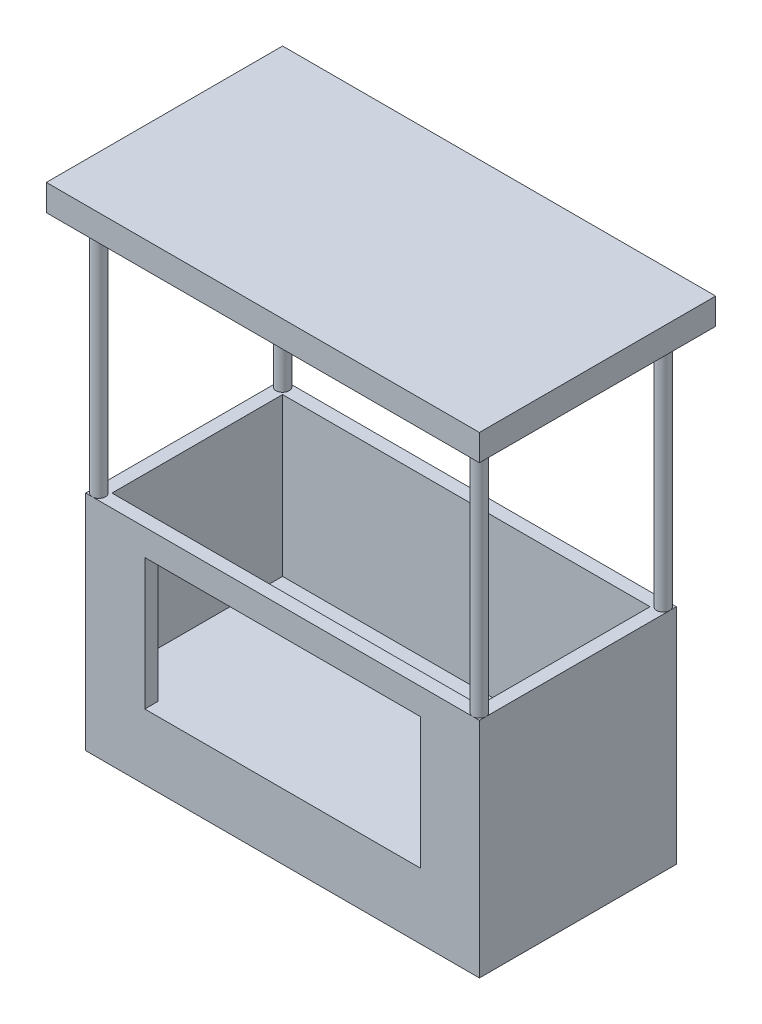
ISO-10303-21;
HEADER;
FILE_DESCRIPTION(('STEP AP214'),'2;1');
FILE_NAME('part.step','',(''),(''),'','','');
FILE_SCHEMA(('AUTOMOTIVE_DESIGN { 1 0 10303 214 1 1 1 1 }'));
ENDSEC;
DATA;
#1=APPLICATION_CONTEXT('core data for automotive mechanical design processes');
#2=APPLICATION_PROTOCOL_DEFINITION('international standard','automotive_design',2000,#1);
#3=PRODUCT_CONTEXT('',#1,'mechanical');
#4=PRODUCT('Part','Part','',(#3));
#5=PRODUCT_RELATED_PRODUCT_CATEGORY('part','',(#4));
#6=PRODUCT_DEFINITION_FORMATION('','',#4);
#7=PRODUCT_DEFINITION_CONTEXT('part definition',#1,'design');
#8=PRODUCT_DEFINITION('design','',#6,#7);
#9=PRODUCT_DEFINITION_SHAPE('','',#8);
#10=(LENGTH_UNIT() NAMED_UNIT(*) SI_UNIT(.MILLI.,.METRE.));
#11=(NAMED_UNIT(*) PLANE_ANGLE_UNIT() SI_UNIT($,.RADIAN.));
#12=(NAMED_UNIT(*) SI_UNIT($,.STERADIAN.) SOLID_ANGLE_UNIT());
#13=UNCERTAINTY_MEASURE_WITH_UNIT(LENGTH_MEASURE(1.E-05),#10,'distance_accuracy_value','');
#14=(GEOMETRIC_REPRESENTATION_CONTEXT(3) GLOBAL_UNCERTAINTY_ASSIGNED_CONTEXT((#13)) GLOBAL_UNIT_ASSIGNED_CONTEXT((#10,
#11,#12)) REPRESENTATION_CONTEXT('',''));
#15=CARTESIAN_POINT('',(0.,0.,0.));
#16=DIRECTION('',(0.,0.,1.));
#17=DIRECTION('',(1.,0.,0.));
#18=AXIS2_PLACEMENT_3D('',#15,#16,#17);
#19=CARTESIAN_POINT('',(0.,34.,0.));
#20=DIRECTION('',(0.,1.,0.));
#21=DIRECTION('',(0.,0.,1.));
#22=AXIS2_PLACEMENT_3D('',#19,#20,#21);
#23=PLANE('',#22);
#24=DIRECTION('',(0.,0.,1.));
#25=VECTOR('',#24,1.);
#26=CARTESIAN_POINT('',(2.,34.,-2.));
#27=LINE('',#26,#25);
#28=CARTESIAN_POINT('',(2.,34.,-28.));
#29=VERTEX_POINT('',#28);
#30=CARTESIAN_POINT('',(2.,34.,-2.));
#31=VERTEX_POINT('',#30);
#32=EDGE_CURVE('E227',#29,#31,#27,.T.);
#33=ORIENTED_EDGE('',*,*,#32,.F.);
#34=DIRECTION('',(-1.,0.,0.));
#35=VECTOR('',#34,1.);
#36=CARTESIAN_POINT('',(2.,34.,-28.));
#37=LINE('',#36,#35);
#38=CARTESIAN_POINT('',(58.,34.,-28.));
#39=VERTEX_POINT('',#38);
#40=EDGE_CURVE('E224',#39,#29,#37,.T.);
#41=ORIENTED_EDGE('',*,*,#40,.F.);
#42=DIRECTION('',(0.,0.,-1.));
#43=VECTOR('',#42,1.);
#44=CARTESIAN_POINT('',(58.,34.,-28.));
#45=LINE('',#44,#43);
#46=CARTESIAN_POINT('',(58.,34.,-2.));
#47=VERTEX_POINT('',#46);
#48=EDGE_CURVE('E233',#47,#39,#45,.T.);
#49=ORIENTED_EDGE('',*,*,#48,.F.);
#50=DIRECTION('',(1.,0.,0.));
#51=VECTOR('',#50,1.);
#52=CARTESIAN_POINT('',(2.,34.,-2.));
#53=LINE('',#52,#51);
#54=EDGE_CURVE('E230',#31,#47,#53,.T.);
#55=ORIENTED_EDGE('',*,*,#54,.F.);
#56=EDGE_LOOP('',(#33,#41,#49,#55));
#57=FACE_BOUND('',#56,.T.);
#58=DIRECTION('',(1.,0.,0.));
#59=VECTOR('',#58,1.);
#60=CARTESIAN_POINT('',(60.,34.,0.));
#61=LINE('',#60,#59);
#62=CARTESIAN_POINT('',(1.,34.,0.));
#63=VERTEX_POINT('',#62);
#64=CARTESIAN_POINT('',(59.,34.,0.));
#65=VERTEX_POINT('',#64);
#66=EDGE_CURVE('E243',#63,#65,#61,.T.);
#67=ORIENTED_EDGE('',*,*,#66,.T.);
#68=CARTESIAN_POINT('',(59.,34.,-1.));
#69=DIRECTION('',(0.,1.,0.));
#70=DIRECTION('',(0.,0.,1.));
#71=AXIS2_PLACEMENT_3D('',#68,#69,#70);
#72=CIRCLE('',#71,0.999999999999998);
#73=CARTESIAN_POINT('',(60.,34.,-1.));
#74=VERTEX_POINT('',#73);
#75=EDGE_CURVE('E11',#65,#74,#72,.F.);
#76=ORIENTED_EDGE('',*,*,#75,.T.);
#77=DIRECTION('',(0.,0.,-1.));
#78=VECTOR('',#77,1.);
#79=CARTESIAN_POINT('',(60.,34.,0.));
#80=LINE('',#79,#78);
#81=CARTESIAN_POINT('',(60.,34.,-29.));
#82=VERTEX_POINT('',#81);
#83=EDGE_CURVE('E249',#74,#82,#80,.T.);
#84=ORIENTED_EDGE('',*,*,#83,.T.);
#85=CARTESIAN_POINT('',(59.,34.,-29.));
#86=DIRECTION('',(0.,1.,0.));
#87=DIRECTION('',(0.,0.,1.));
#88=AXIS2_PLACEMENT_3D('',#85,#86,#87);
#89=CIRCLE('',#88,0.999999999999991);
#90=CARTESIAN_POINT('',(59.,34.,-30.));
#91=VERTEX_POINT('',#90);
#92=EDGE_CURVE('E44',#82,#91,#89,.F.);
#93=ORIENTED_EDGE('',*,*,#92,.T.);
#94=DIRECTION('',(-1.,0.,0.));
#95=VECTOR('',#94,1.);
#96=CARTESIAN_POINT('',(60.,34.,-30.));
#97=LINE('',#96,#95);
#98=CARTESIAN_POINT('',(1.,34.,-30.));
#99=VERTEX_POINT('',#98);
#100=EDGE_CURVE('E254',#91,#99,#97,.T.);
#101=ORIENTED_EDGE('',*,*,#100,.T.);
#102=CARTESIAN_POINT('',(1.,34.,-29.));
#103=DIRECTION('',(0.,1.,0.));
#104=DIRECTION('',(0.,0.,1.));
#105=AXIS2_PLACEMENT_3D('',#102,#103,#104);
#106=CIRCLE('',#105,1.);
#107=CARTESIAN_POINT('',(0.,34.,-29.));
#108=VERTEX_POINT('',#107);
#109=EDGE_CURVE('E223',#108,#99,#106,.T.);
#110=ORIENTED_EDGE('',*,*,#109,.F.);
#111=DIRECTION('',(0.,0.,1.));
#112=VECTOR('',#111,1.);
#113=CARTESIAN_POINT('',(0.,34.,-30.));
#114=LINE('',#113,#112);
#115=CARTESIAN_POINT('',(0.,34.,-1.));
#116=VERTEX_POINT('',#115);
#117=EDGE_CURVE('E259',#108,#116,#114,.T.);
#118=ORIENTED_EDGE('',*,*,#117,.T.);
#119=CARTESIAN_POINT('',(1.,34.,-1.));
#120=DIRECTION('',(0.,1.,0.));
#121=DIRECTION('',(0.,0.,1.));
#122=AXIS2_PLACEMENT_3D('',#119,#120,#121);
#123=CIRCLE('',#122,1.);
#124=EDGE_CURVE('E210',#63,#116,#123,.T.);
#125=ORIENTED_EDGE('',*,*,#124,.F.);
#126=EDGE_LOOP('',(#67,#76,#84,#93,#101,#110,#118,#125));
#127=FACE_BOUND('',#126,.T.);
#128=ADVANCED_FACE('F36',(#57,#127),#23,.T.);
#129=CARTESIAN_POINT('',(60.,34.,-30.));
#130=VERTEX_POINT('',#129);
#131=EDGE_CURVE('E250',#130,#91,#97,.T.);
#132=ORIENTED_EDGE('',*,*,#131,.T.);
#133=CARTESIAN_POINT('',(59.,34.,-29.));
#134=DIRECTION('',(0.,1.,0.));
#135=DIRECTION('',(0.,0.,1.));
#136=AXIS2_PLACEMENT_3D('',#133,#134,#135);
#137=CIRCLE('',#136,0.999999999999991);
#138=EDGE_CURVE('E55',#82,#91,#137,.T.);
#139=ORIENTED_EDGE('',*,*,#138,.F.);
#140=EDGE_CURVE('E242',#82,#130,#80,.T.);
#141=ORIENTED_EDGE('',*,*,#140,.T.);
#142=EDGE_LOOP('',(#132,#139,#141));
#143=FACE_BOUND('',#142,.T.);
#144=ADVANCED_FACE('F348',(#143),#23,.T.);
#145=CARTESIAN_POINT('',(0.,34.,0.));
#146=VERTEX_POINT('',#145);
#147=EDGE_CURVE('E239',#146,#63,#61,.T.);
#148=ORIENTED_EDGE('',*,*,#147,.T.);
#149=CARTESIAN_POINT('',(1.,34.,-1.));
#150=DIRECTION('',(0.,1.,0.));
#151=DIRECTION('',(0.,0.,1.));
#152=AXIS2_PLACEMENT_3D('',#149,#150,#151);
#153=CIRCLE('',#152,1.);
#154=EDGE_CURVE('E335',#63,#116,#153,.F.);
#155=ORIENTED_EDGE('',*,*,#154,.T.);
#156=EDGE_CURVE('E253',#116,#146,#114,.T.);
#157=ORIENTED_EDGE('',*,*,#156,.T.);
#158=EDGE_LOOP('',(#148,#155,#157));
#159=FACE_BOUND('',#158,.T.);
#160=ADVANCED_FACE('F373',(#159),#23,.T.);
#161=EDGE_CURVE('E215',#99,#108,#106,.T.);
#162=ORIENTED_EDGE('',*,*,#161,.F.);
#163=CARTESIAN_POINT('',(0.,34.,-30.));
#164=VERTEX_POINT('',#163);
#165=EDGE_CURVE('E248',#99,#164,#97,.T.);
#166=ORIENTED_EDGE('',*,*,#165,.T.);
#167=EDGE_CURVE('E255',#164,#108,#114,.T.);
#168=ORIENTED_EDGE('',*,*,#167,.T.);
#169=EDGE_LOOP('',(#162,#166,#168));
#170=FACE_BOUND('',#169,.T.);
#171=ADVANCED_FACE('F366',(#170),#23,.T.);
#172=CARTESIAN_POINT('',(0.,10.,0.));
#173=DIRECTION('',(0.,-1.,0.));
#174=DIRECTION('',(0.,0.,-1.));
#175=AXIS2_PLACEMENT_3D('',#172,#173,#174);
#176=PLANE('',#175);
#177=CARTESIAN_POINT('',(52.5830119542547,10.,-22.9074017616426));
#178=DIRECTION('',(0.,1.,0.));
#179=DIRECTION('',(0.,0.,1.));
#180=AXIS2_PLACEMENT_3D('',#177,#178,#179);
#181=CIRCLE('',#180,5.);
#182=CARTESIAN_POINT('',(52.5830119542547,10.,-17.9074017616426));
#183=VERTEX_POINT('',#182);
#184=EDGE_CURVE('E644',#183,#183,#181,.T.);
#185=ORIENTED_EDGE('',*,*,#184,.F.);
#186=EDGE_LOOP('',(#185));
#187=FACE_BOUND('',#186,.T.);
#188=DIRECTION('',(0.,0.,1.));
#189=VECTOR('',#188,1.);
#190=CARTESIAN_POINT('',(51.,10.,0.));
#191=LINE('',#190,#189);
#192=CARTESIAN_POINT('',(51.,10.,-2.));
#193=VERTEX_POINT('',#192);
#194=CARTESIAN_POINT('',(51.,10.,0.));
#195=VERTEX_POINT('',#194);
#196=EDGE_CURVE('E266',#193,#195,#191,.T.);
#197=ORIENTED_EDGE('',*,*,#196,.F.);
#198=DIRECTION('',(-1.,0.,0.));
#199=VECTOR('',#198,1.);
#200=CARTESIAN_POINT('',(51.,10.,-2.));
#201=LINE('',#200,#199);
#202=CARTESIAN_POINT('',(58.,10.,-2.));
#203=VERTEX_POINT('',#202);
#204=EDGE_CURVE('E284',#203,#193,#201,.T.);
#205=ORIENTED_EDGE('',*,*,#204,.F.);
#206=DIRECTION('',(0.,0.,1.));
#207=VECTOR('',#206,1.);
#208=CARTESIAN_POINT('',(58.,10.,-2.));
#209=LINE('',#208,#207);
#210=CARTESIAN_POINT('',(58.,10.,-28.));
#211=VERTEX_POINT('',#210);
#212=EDGE_CURVE('E281',#211,#203,#209,.T.);
#213=ORIENTED_EDGE('',*,*,#212,.F.);
#214=DIRECTION('',(1.,0.,0.));
#215=VECTOR('',#214,1.);
#216=CARTESIAN_POINT('',(58.,10.,-28.));
#217=LINE('',#216,#215);
#218=CARTESIAN_POINT('',(2.,10.,-28.));
#219=VERTEX_POINT('',#218);
#220=EDGE_CURVE('E278',#219,#211,#217,.T.);
#221=ORIENTED_EDGE('',*,*,#220,.F.);
#222=DIRECTION('',(0.,0.,-1.));
#223=VECTOR('',#222,1.);
#224=CARTESIAN_POINT('',(2.,10.,-28.));
#225=LINE('',#224,#223);
#226=CARTESIAN_POINT('',(2.,10.,-2.));
#227=VERTEX_POINT('',#226);
#228=EDGE_CURVE('E275',#227,#219,#225,.T.);
#229=ORIENTED_EDGE('',*,*,#228,.F.);
#230=DIRECTION('',(-1.,0.,0.));
#231=VECTOR('',#230,1.);
#232=CARTESIAN_POINT('',(2.,10.,-2.));
#233=LINE('',#232,#231);
#234=CARTESIAN_POINT('',(9.,10.,-2.));
#235=VERTEX_POINT('',#234);
#236=EDGE_CURVE('E272',#235,#227,#233,.T.);
#237=ORIENTED_EDGE('',*,*,#236,.F.);
#238=DIRECTION('',(0.,0.,-1.));
#239=VECTOR('',#238,1.);
#240=CARTESIAN_POINT('',(9.,10.,-2.));
#241=LINE('',#240,#239);
#242=CARTESIAN_POINT('',(9.,10.,0.));
#243=VERTEX_POINT('',#242);
#244=EDGE_CURVE('E258',#243,#235,#241,.T.);
#245=ORIENTED_EDGE('',*,*,#244,.F.);
#246=DIRECTION('',(1.,0.,0.));
#247=VECTOR('',#246,1.);
#248=CARTESIAN_POINT('',(0.,10.,0.));
#249=LINE('',#248,#247);
#250=EDGE_CURVE('E313',#243,#195,#249,.T.);
#251=ORIENTED_EDGE('',*,*,#250,.T.);
#252=EDGE_LOOP('',(#197,#205,#213,#221,#229,#237,#245,#251));
#253=FACE_BOUND('',#252,.T.);
#254=ADVANCED_FACE('F408',(#187,#253),#176,.F.);
#255=CARTESIAN_POINT('',(0.,10.,0.));
#256=DIRECTION('',(1.,0.,0.));
#257=DIRECTION('',(0.,0.,-1.));
#258=AXIS2_PLACEMENT_3D('',#255,#256,#257);
#259=PLANE('',#258);
#260=DIRECTION('',(0.,0.,1.));
#261=VECTOR('',#260,1.);
#262=CARTESIAN_POINT('',(0.,0.,0.));
#263=LINE('',#262,#261);
#264=CARTESIAN_POINT('',(0.,0.,-30.));
#265=VERTEX_POINT('',#264);
#266=CARTESIAN_POINT('',(0.,0.,0.));
#267=VERTEX_POINT('',#266);
#268=EDGE_CURVE('E312',#265,#267,#263,.T.);
#269=ORIENTED_EDGE('',*,*,#268,.T.);
#270=DIRECTION('',(0.,-1.,0.));
#271=VECTOR('',#270,1.);
#272=CARTESIAN_POINT('',(0.,10.,0.));
#273=LINE('',#272,#271);
#274=EDGE_CURVE('E332',#146,#267,#273,.T.);
#275=ORIENTED_EDGE('',*,*,#274,.F.);
#276=ORIENTED_EDGE('',*,*,#156,.F.);
#277=ORIENTED_EDGE('',*,*,#117,.F.);
#278=ORIENTED_EDGE('',*,*,#167,.F.);
#279=DIRECTION('',(0.,-1.,0.));
#280=VECTOR('',#279,1.);
#281=CARTESIAN_POINT('',(0.,10.,-30.));
#282=LINE('',#281,#280);
#283=EDGE_CURVE('E315',#164,#265,#282,.T.);
#284=ORIENTED_EDGE('',*,*,#283,.T.);
#285=EDGE_LOOP('',(#269,#275,#276,#277,#278,#284));
#286=FACE_BOUND('',#285,.T.);
#287=ADVANCED_FACE('F38',(#286),#259,.F.);
#288=CARTESIAN_POINT('',(0.,10.,0.));
#289=DIRECTION('',(0.,0.,-1.));
#290=DIRECTION('',(-1.,0.,0.));
#291=AXIS2_PLACEMENT_3D('',#288,#289,#290);
#292=PLANE('',#291);
#293=DIRECTION('',(0.,-1.,0.));
#294=VECTOR('',#293,1.);
#295=CARTESIAN_POINT('',(9.,30.,0.));
#296=LINE('',#295,#294);
#297=CARTESIAN_POINT('',(9.,30.,0.));
#298=VERTEX_POINT('',#297);
#299=EDGE_CURVE('E309',#298,#243,#296,.T.);
#300=ORIENTED_EDGE('',*,*,#299,.F.);
#301=DIRECTION('',(1.,0.,0.));
#302=VECTOR('',#301,1.);
#303=CARTESIAN_POINT('',(60.,30.,0.));
#304=LINE('',#303,#302);
#305=CARTESIAN_POINT('',(51.,30.,0.));
#306=VERTEX_POINT('',#305);
#307=EDGE_CURVE('E236',#298,#306,#304,.T.);
#308=ORIENTED_EDGE('',*,*,#307,.T.);
#309=DIRECTION('',(0.,-1.,0.));
#310=VECTOR('',#309,1.);
#311=CARTESIAN_POINT('',(51.,30.,0.));
#312=LINE('',#311,#310);
#313=EDGE_CURVE('E269',#306,#195,#312,.T.);
#314=ORIENTED_EDGE('',*,*,#313,.T.);
#315=ORIENTED_EDGE('',*,*,#250,.F.);
#316=EDGE_LOOP('',(#300,#308,#314,#315));
#317=FACE_BOUND('',#316,.T.);
#318=DIRECTION('',(1.,0.,0.));
#319=VECTOR('',#318,1.);
#320=CARTESIAN_POINT('',(0.,0.,0.));
#321=LINE('',#320,#319);
#322=CARTESIAN_POINT('',(60.,0.,0.));
#323=VERTEX_POINT('',#322);
#324=EDGE_CURVE('E319',#267,#323,#321,.T.);
#325=ORIENTED_EDGE('',*,*,#324,.T.);
#326=DIRECTION('',(0.,-1.,0.));
#327=VECTOR('',#326,1.);
#328=CARTESIAN_POINT('',(60.,10.,0.));
#329=LINE('',#328,#327);
#330=CARTESIAN_POINT('',(60.,34.,0.));
#331=VERTEX_POINT('',#330);
#332=EDGE_CURVE('E329',#331,#323,#329,.T.);
#333=ORIENTED_EDGE('',*,*,#332,.F.);
#334=EDGE_CURVE('E244',#65,#331,#61,.T.);
#335=ORIENTED_EDGE('',*,*,#334,.F.);
#336=ORIENTED_EDGE('',*,*,#66,.F.);
#337=ORIENTED_EDGE('',*,*,#147,.F.);
#338=ORIENTED_EDGE('',*,*,#274,.T.);
#339=EDGE_LOOP('',(#325,#333,#335,#336,#337,#338));
#340=FACE_BOUND('',#339,.T.);
#341=ADVANCED_FACE('F525',(#317,#340),#292,.F.);
#342=CARTESIAN_POINT('',(60.,10.,-30.));
#343=DIRECTION('',(-1.,0.,0.));
#344=DIRECTION('',(0.,0.,1.));
#345=AXIS2_PLACEMENT_3D('',#342,#343,#344);
#346=PLANE('',#345);
#347=DIRECTION('',(0.,0.,-1.));
#348=VECTOR('',#347,1.);
#349=CARTESIAN_POINT('',(60.,0.,-30.));
#350=LINE('',#349,#348);
#351=CARTESIAN_POINT('',(60.,0.,-30.));
#352=VERTEX_POINT('',#351);
#353=EDGE_CURVE('E321',#323,#352,#350,.T.);
#354=ORIENTED_EDGE('',*,*,#353,.T.);
#355=DIRECTION('',(0.,-1.,0.));
#356=VECTOR('',#355,1.);
#357=CARTESIAN_POINT('',(60.,10.,-30.));
#358=LINE('',#357,#356);
#359=EDGE_CURVE('E326',#130,#352,#358,.T.);
#360=ORIENTED_EDGE('',*,*,#359,.F.);
#361=ORIENTED_EDGE('',*,*,#140,.F.);
#362=ORIENTED_EDGE('',*,*,#83,.F.);
#363=EDGE_CURVE('E245',#331,#74,#80,.T.);
#364=ORIENTED_EDGE('',*,*,#363,.F.);
#365=ORIENTED_EDGE('',*,*,#332,.T.);
#366=EDGE_LOOP('',(#354,#360,#361,#362,#364,#365));
#367=FACE_BOUND('',#366,.T.);
#368=ADVANCED_FACE('F352',(#367),#346,.F.);
#369=CARTESIAN_POINT('',(0.,10.,-30.));
#370=DIRECTION('',(0.,0.,1.));
#371=DIRECTION('',(1.,0.,0.));
#372=AXIS2_PLACEMENT_3D('',#369,#370,#371);
#373=PLANE('',#372);
#374=DIRECTION('',(-1.,0.,0.));
#375=VECTOR('',#374,1.);
#376=CARTESIAN_POINT('',(0.,0.,-30.));
#377=LINE('',#376,#375);
#378=EDGE_CURVE('E316',#352,#265,#377,.T.);
#379=ORIENTED_EDGE('',*,*,#378,.T.);
#380=ORIENTED_EDGE('',*,*,#283,.F.);
#381=ORIENTED_EDGE('',*,*,#165,.F.);
#382=ORIENTED_EDGE('',*,*,#100,.F.);
#383=ORIENTED_EDGE('',*,*,#131,.F.);
#384=ORIENTED_EDGE('',*,*,#359,.T.);
#385=EDGE_LOOP('',(#379,#380,#381,#382,#383,#384));
#386=FACE_BOUND('',#385,.T.);
#387=ADVANCED_FACE('F344',(#386),#373,.F.);
#388=CARTESIAN_POINT('',(0.,0.,0.));
#389=DIRECTION('',(0.,-1.,0.));
#390=DIRECTION('',(0.,0.,-1.));
#391=AXIS2_PLACEMENT_3D('',#388,#389,#390);
#392=PLANE('',#391);
#393=CARTESIAN_POINT('',(52.5830119542547,0.,-22.9074017616426));
#394=DIRECTION('',(0.,-1.,0.));
#395=DIRECTION('',(0.,0.,-1.));
#396=AXIS2_PLACEMENT_3D('',#393,#394,#395);
#397=CIRCLE('',#396,5.);
#398=CARTESIAN_POINT('',(52.5830119542547,0.,-27.9074017616426));
#399=VERTEX_POINT('',#398);
#400=EDGE_CURVE('E641',#399,#399,#397,.F.);
#401=ORIENTED_EDGE('',*,*,#400,.T.);
#402=EDGE_LOOP('',(#401));
#403=FACE_BOUND('',#402,.T.);
#404=ORIENTED_EDGE('',*,*,#268,.F.);
#405=ORIENTED_EDGE('',*,*,#378,.F.);
#406=ORIENTED_EDGE('',*,*,#353,.F.);
#407=ORIENTED_EDGE('',*,*,#324,.F.);
#408=EDGE_LOOP('',(#404,#405,#406,#407));
#409=FACE_BOUND('',#408,.T.);
#410=ADVANCED_FACE('F357',(#403,#409),#392,.T.);
#411=CARTESIAN_POINT('',(9.,30.,-2.));
#412=DIRECTION('',(-1.,0.,0.));
#413=DIRECTION('',(0.,0.,1.));
#414=AXIS2_PLACEMENT_3D('',#411,#412,#413);
#415=PLANE('',#414);
#416=ORIENTED_EDGE('',*,*,#244,.T.);
#417=DIRECTION('',(0.,-1.,0.));
#418=VECTOR('',#417,1.);
#419=CARTESIAN_POINT('',(9.,30.,-2.));
#420=LINE('',#419,#418);
#421=CARTESIAN_POINT('',(9.,30.,-2.));
#422=VERTEX_POINT('',#421);
#423=EDGE_CURVE('E306',#422,#235,#420,.T.);
#424=ORIENTED_EDGE('',*,*,#423,.F.);
#425=DIRECTION('',(0.,0.,-1.));
#426=VECTOR('',#425,1.);
#427=CARTESIAN_POINT('',(9.,30.,-2.));
#428=LINE('',#427,#426);
#429=EDGE_CURVE('E262',#298,#422,#428,.T.);
#430=ORIENTED_EDGE('',*,*,#429,.F.);
#431=ORIENTED_EDGE('',*,*,#299,.T.);
#432=EDGE_LOOP('',(#416,#424,#430,#431));
#433=FACE_BOUND('',#432,.T.);
#434=ADVANCED_FACE('F487',(#433),#415,.F.);
#435=CARTESIAN_POINT('',(2.,30.,-2.));
#436=DIRECTION('',(0.,0.,1.));
#437=DIRECTION('',(1.,0.,0.));
#438=AXIS2_PLACEMENT_3D('',#435,#436,#437);
#439=PLANE('',#438);
#440=ORIENTED_EDGE('',*,*,#236,.T.);
#441=DIRECTION('',(0.,-1.,0.));
#442=VECTOR('',#441,1.);
#443=CARTESIAN_POINT('',(2.,30.,-2.));
#444=LINE('',#443,#442);
#445=EDGE_CURVE('E303',#31,#227,#444,.T.);
#446=ORIENTED_EDGE('',*,*,#445,.F.);
#447=ORIENTED_EDGE('',*,*,#54,.T.);
#448=DIRECTION('',(0.,-1.,0.));
#449=VECTOR('',#448,1.);
#450=CARTESIAN_POINT('',(58.,30.,-2.));
#451=LINE('',#450,#449);
#452=EDGE_CURVE('E294',#47,#203,#451,.T.);
#453=ORIENTED_EDGE('',*,*,#452,.T.);
#454=ORIENTED_EDGE('',*,*,#204,.T.);
#455=DIRECTION('',(0.,-1.,0.));
#456=VECTOR('',#455,1.);
#457=CARTESIAN_POINT('',(51.,30.,-2.));
#458=LINE('',#457,#456);
#459=CARTESIAN_POINT('',(51.,30.,-2.));
#460=VERTEX_POINT('',#459);
#461=EDGE_CURVE('E291',#460,#193,#458,.T.);
#462=ORIENTED_EDGE('',*,*,#461,.F.);
#463=DIRECTION('',(1.,0.,0.));
#464=VECTOR('',#463,1.);
#465=CARTESIAN_POINT('',(2.,30.,-2.));
#466=LINE('',#465,#464);
#467=EDGE_CURVE('E220',#422,#460,#466,.T.);
#468=ORIENTED_EDGE('',*,*,#467,.F.);
#469=ORIENTED_EDGE('',*,*,#423,.T.);
#470=EDGE_LOOP('',(#440,#446,#447,#453,#454,#462,#468,#469));
#471=FACE_BOUND('',#470,.T.);
#472=ADVANCED_FACE('F476',(#471),#439,.F.);
#473=CARTESIAN_POINT('',(2.,30.,-28.));
#474=DIRECTION('',(-1.,0.,0.));
#475=DIRECTION('',(0.,0.,1.));
#476=AXIS2_PLACEMENT_3D('',#473,#474,#475);
#477=PLANE('',#476);
#478=ORIENTED_EDGE('',*,*,#228,.T.);
#479=DIRECTION('',(0.,-1.,0.));
#480=VECTOR('',#479,1.);
#481=CARTESIAN_POINT('',(2.,30.,-28.));
#482=LINE('',#481,#480);
#483=EDGE_CURVE('E300',#29,#219,#482,.T.);
#484=ORIENTED_EDGE('',*,*,#483,.F.);
#485=ORIENTED_EDGE('',*,*,#32,.T.);
#486=ORIENTED_EDGE('',*,*,#445,.T.);
#487=EDGE_LOOP('',(#478,#484,#485,#486));
#488=FACE_BOUND('',#487,.T.);
#489=ADVANCED_FACE('F465',(#488),#477,.F.);
#490=CARTESIAN_POINT('',(58.,30.,-28.));
#491=DIRECTION('',(0.,0.,-1.));
#492=DIRECTION('',(-1.,0.,0.));
#493=AXIS2_PLACEMENT_3D('',#490,#491,#492);
#494=PLANE('',#493);
#495=ORIENTED_EDGE('',*,*,#220,.T.);
#496=DIRECTION('',(0.,-1.,0.));
#497=VECTOR('',#496,1.);
#498=CARTESIAN_POINT('',(58.,30.,-28.));
#499=LINE('',#498,#497);
#500=EDGE_CURVE('E297',#39,#211,#499,.T.);
#501=ORIENTED_EDGE('',*,*,#500,.F.);
#502=ORIENTED_EDGE('',*,*,#40,.T.);
#503=ORIENTED_EDGE('',*,*,#483,.T.);
#504=EDGE_LOOP('',(#495,#501,#502,#503));
#505=FACE_BOUND('',#504,.T.);
#506=ADVANCED_FACE('F455',(#505),#494,.F.);
#507=CARTESIAN_POINT('',(58.,30.,-2.));
#508=DIRECTION('',(1.,0.,0.));
#509=DIRECTION('',(0.,0.,-1.));
#510=AXIS2_PLACEMENT_3D('',#507,#508,#509);
#511=PLANE('',#510);
#512=ORIENTED_EDGE('',*,*,#212,.T.);
#513=ORIENTED_EDGE('',*,*,#452,.F.);
#514=ORIENTED_EDGE('',*,*,#48,.T.);
#515=ORIENTED_EDGE('',*,*,#500,.T.);
#516=EDGE_LOOP('',(#512,#513,#514,#515));
#517=FACE_BOUND('',#516,.T.);
#518=ADVANCED_FACE('F444',(#517),#511,.F.);
#519=CARTESIAN_POINT('',(51.,30.,0.));
#520=DIRECTION('',(1.,0.,0.));
#521=DIRECTION('',(0.,0.,-1.));
#522=AXIS2_PLACEMENT_3D('',#519,#520,#521);
#523=PLANE('',#522);
#524=ORIENTED_EDGE('',*,*,#196,.T.);
#525=ORIENTED_EDGE('',*,*,#313,.F.);
#526=DIRECTION('',(0.,0.,1.));
#527=VECTOR('',#526,1.);
#528=CARTESIAN_POINT('',(51.,30.,0.));
#529=LINE('',#528,#527);
#530=EDGE_CURVE('E265',#460,#306,#529,.T.);
#531=ORIENTED_EDGE('',*,*,#530,.F.);
#532=ORIENTED_EDGE('',*,*,#461,.T.);
#533=EDGE_LOOP('',(#524,#525,#531,#532));
#534=FACE_BOUND('',#533,.T.);
#535=ADVANCED_FACE('F405',(#534),#523,.F.);
#536=CARTESIAN_POINT('',(0.,30.,0.));
#537=DIRECTION('',(0.,1.,0.));
#538=DIRECTION('',(0.,0.,1.));
#539=AXIS2_PLACEMENT_3D('',#536,#537,#538);
#540=PLANE('',#539);
#541=ORIENTED_EDGE('',*,*,#307,.F.);
#542=ORIENTED_EDGE('',*,*,#429,.T.);
#543=ORIENTED_EDGE('',*,*,#467,.T.);
#544=ORIENTED_EDGE('',*,*,#530,.T.);
#545=EDGE_LOOP('',(#541,#542,#543,#544));
#546=FACE_BOUND('',#545,.T.);
#547=ADVANCED_FACE('F400',(#546),#540,.F.);
#548=ORIENTED_EDGE('',*,*,#363,.T.);
#549=CARTESIAN_POINT('',(59.,34.,-1.));
#550=DIRECTION('',(0.,1.,0.));
#551=DIRECTION('',(0.,0.,1.));
#552=AXIS2_PLACEMENT_3D('',#549,#550,#551);
#553=CIRCLE('',#552,0.999999999999998);
#554=EDGE_CURVE('E197',#65,#74,#553,.T.);
#555=ORIENTED_EDGE('',*,*,#554,.F.);
#556=ORIENTED_EDGE('',*,*,#334,.T.);
#557=EDGE_LOOP('',(#548,#555,#556));
#558=FACE_BOUND('',#557,.T.);
#559=ADVANCED_FACE('F387',(#558),#23,.T.);
#560=CARTESIAN_POINT('',(1.,71.,-29.));
#561=DIRECTION('',(0.,-1.,0.));
#562=DIRECTION('',(0.,0.,-1.));
#563=AXIS2_PLACEMENT_3D('',#560,#561,#562);
#564=CYLINDRICAL_SURFACE('',#563,1.);
#565=CARTESIAN_POINT('',(1.,71.,-29.));
#566=DIRECTION('',(0.,1.,0.));
#567=DIRECTION('',(0.,0.,1.));
#568=AXIS2_PLACEMENT_3D('',#565,#566,#567);
#569=CIRCLE('',#568,1.);
#570=CARTESIAN_POINT('',(1.,71.,-28.));
#571=VERTEX_POINT('',#570);
#572=EDGE_CURVE('E217',#571,#571,#569,.T.);
#573=ORIENTED_EDGE('',*,*,#572,.F.);
#574=EDGE_LOOP('',(#573));
#575=FACE_BOUND('',#574,.T.);
#576=ORIENTED_EDGE('',*,*,#161,.T.);
#577=ORIENTED_EDGE('',*,*,#109,.T.);
#578=EDGE_LOOP('',(#576,#577));
#579=FACE_BOUND('',#578,.T.);
#580=ADVANCED_FACE('F369',(#575,#579),#564,.T.);
#581=CARTESIAN_POINT('',(1.,71.,-1.));
#582=DIRECTION('',(0.,-1.,0.));
#583=DIRECTION('',(0.,0.,-1.));
#584=AXIS2_PLACEMENT_3D('',#581,#582,#583);
#585=CYLINDRICAL_SURFACE('',#584,1.);
#586=CARTESIAN_POINT('',(1.,71.,-1.));
#587=DIRECTION('',(0.,1.,0.));
#588=DIRECTION('',(0.,0.,1.));
#589=AXIS2_PLACEMENT_3D('',#586,#587,#588);
#590=CIRCLE('',#589,1.);
#591=CARTESIAN_POINT('',(1.,71.,0.));
#592=VERTEX_POINT('',#591);
#593=EDGE_CURVE('E212',#592,#592,#590,.T.);
#594=ORIENTED_EDGE('',*,*,#593,.F.);
#595=EDGE_LOOP('',(#594));
#596=FACE_BOUND('',#595,.T.);
#597=ORIENTED_EDGE('',*,*,#124,.T.);
#598=ORIENTED_EDGE('',*,*,#154,.F.);
#599=EDGE_LOOP('',(#597,#598));
#600=FACE_BOUND('',#599,.T.);
#601=ADVANCED_FACE('F375',(#596,#600),#585,.T.);
#602=CARTESIAN_POINT('',(59.,71.,-29.));
#603=DIRECTION('',(0.,-1.,0.));
#604=DIRECTION('',(0.,0.,-1.));
#605=AXIS2_PLACEMENT_3D('',#602,#603,#604);
#606=CYLINDRICAL_SURFACE('',#605,0.999999999999991);
#607=CARTESIAN_POINT('',(59.,71.,-29.));
#608=DIRECTION('',(0.,1.,0.));
#609=DIRECTION('',(0.,0.,1.));
#610=AXIS2_PLACEMENT_3D('',#607,#608,#609);
#611=CIRCLE('',#610,0.999999999999991);
#612=CARTESIAN_POINT('',(59.,71.,-28.));
#613=VERTEX_POINT('',#612);
#614=EDGE_CURVE('E207',#613,#613,#611,.T.);
#615=ORIENTED_EDGE('',*,*,#614,.F.);
#616=EDGE_LOOP('',(#615));
#617=FACE_BOUND('',#616,.T.);
#618=ORIENTED_EDGE('',*,*,#138,.T.);
#619=ORIENTED_EDGE('',*,*,#92,.F.);
#620=EDGE_LOOP('',(#618,#619));
#621=FACE_BOUND('',#620,.T.);
#622=ADVANCED_FACE('F377',(#617,#621),#606,.T.);
#623=CARTESIAN_POINT('',(59.,71.,-1.));
#624=DIRECTION('',(0.,-1.,0.));
#625=DIRECTION('',(0.,0.,-1.));
#626=AXIS2_PLACEMENT_3D('',#623,#624,#625);
#627=CYLINDRICAL_SURFACE('',#626,0.999999999999998);
#628=CARTESIAN_POINT('',(59.,71.,-1.));
#629=DIRECTION('',(0.,1.,0.));
#630=DIRECTION('',(0.,0.,1.));
#631=AXIS2_PLACEMENT_3D('',#628,#629,#630);
#632=CIRCLE('',#631,0.999999999999998);
#633=CARTESIAN_POINT('',(59.,71.,0.));
#634=VERTEX_POINT('',#633);
#635=EDGE_CURVE('E199',#634,#634,#632,.T.);
#636=ORIENTED_EDGE('',*,*,#635,.F.);
#637=EDGE_LOOP('',(#636));
#638=FACE_BOUND('',#637,.T.);
#639=ORIENTED_EDGE('',*,*,#554,.T.);
#640=ORIENTED_EDGE('',*,*,#75,.F.);
#641=EDGE_LOOP('',(#639,#640));
#642=FACE_BOUND('',#641,.T.);
#643=ADVANCED_FACE('F384',(#638,#642),#627,.T.);
#644=CARTESIAN_POINT('',(63.,75.,-33.));
#645=DIRECTION('',(0.,0.,1.));
#646=DIRECTION('',(1.,0.,0.));
#647=AXIS2_PLACEMENT_3D('',#644,#645,#646);
#648=PLANE('',#647);
#649=DIRECTION('',(-1.,0.,0.));
#650=VECTOR('',#649,1.);
#651=CARTESIAN_POINT('',(63.,71.,-33.));
#652=LINE('',#651,#650);
#653=CARTESIAN_POINT('',(63.,71.,-33.));
#654=VERTEX_POINT('',#653);
#655=CARTESIAN_POINT('',(-3.,71.,-33.));
#656=VERTEX_POINT('',#655);
#657=EDGE_CURVE('E196',#654,#656,#652,.T.);
#658=ORIENTED_EDGE('',*,*,#657,.T.);
#659=DIRECTION('',(0.,-1.,0.));
#660=VECTOR('',#659,1.);
#661=CARTESIAN_POINT('',(-3.,75.,-33.));
#662=LINE('',#661,#660);
#663=CARTESIAN_POINT('',(-3.,75.,-33.));
#664=VERTEX_POINT('',#663);
#665=EDGE_CURVE('E176',#664,#656,#662,.T.);
#666=ORIENTED_EDGE('',*,*,#665,.F.);
#667=DIRECTION('',(-1.,0.,0.));
#668=VECTOR('',#667,1.);
#669=CARTESIAN_POINT('',(63.,75.,-33.));
#670=LINE('',#669,#668);
#671=CARTESIAN_POINT('',(63.,75.,-33.));
#672=VERTEX_POINT('',#671);
#673=EDGE_CURVE('E183',#672,#664,#670,.T.);
#674=ORIENTED_EDGE('',*,*,#673,.F.);
#675=DIRECTION('',(0.,-1.,0.));
#676=VECTOR('',#675,1.);
#677=CARTESIAN_POINT('',(63.,75.,-33.));
#678=LINE('',#677,#676);
#679=EDGE_CURVE('E651',#672,#654,#678,.T.);
#680=ORIENTED_EDGE('',*,*,#679,.T.);
#681=EDGE_LOOP('',(#658,#666,#674,#680));
#682=FACE_BOUND('',#681,.T.);
#683=ADVANCED_FACE('F194',(#682),#648,.F.);
#684=CARTESIAN_POINT('',(-3.,75.,-33.));
#685=DIRECTION('',(1.,0.,0.));
#686=DIRECTION('',(0.,0.,-1.));
#687=AXIS2_PLACEMENT_3D('',#684,#685,#686);
#688=PLANE('',#687);
#689=DIRECTION('',(0.,0.,1.));
#690=VECTOR('',#689,1.);
#691=CARTESIAN_POINT('',(-3.,71.,-33.));
#692=LINE('',#691,#690);
#693=CARTESIAN_POINT('',(-3.,71.,3.));
#694=VERTEX_POINT('',#693);
#695=EDGE_CURVE('E646',#656,#694,#692,.T.);
#696=ORIENTED_EDGE('',*,*,#695,.T.);
#697=DIRECTION('',(0.,-1.,0.));
#698=VECTOR('',#697,1.);
#699=CARTESIAN_POINT('',(-3.,75.,3.));
#700=LINE('',#699,#698);
#701=CARTESIAN_POINT('',(-3.,75.,3.));
#702=VERTEX_POINT('',#701);
#703=EDGE_CURVE('E179',#702,#694,#700,.T.);
#704=ORIENTED_EDGE('',*,*,#703,.F.);
#705=DIRECTION('',(0.,0.,1.));
#706=VECTOR('',#705,1.);
#707=CARTESIAN_POINT('',(-3.,75.,-33.));
#708=LINE('',#707,#706);
#709=EDGE_CURVE('E172',#664,#702,#708,.T.);
#710=ORIENTED_EDGE('',*,*,#709,.F.);
#711=ORIENTED_EDGE('',*,*,#665,.T.);
#712=EDGE_LOOP('',(#696,#704,#710,#711));
#713=FACE_BOUND('',#712,.T.);
#714=ADVANCED_FACE('F174',(#713),#688,.F.);
#715=CARTESIAN_POINT('',(-3.,75.,3.));
#716=DIRECTION('',(0.,0.,-1.));
#717=DIRECTION('',(-1.,0.,0.));
#718=AXIS2_PLACEMENT_3D('',#715,#716,#717);
#719=PLANE('',#718);
#720=DIRECTION('',(1.,0.,0.));
#721=VECTOR('',#720,1.);
#722=CARTESIAN_POINT('',(-3.,71.,3.));
#723=LINE('',#722,#721);
#724=CARTESIAN_POINT('',(63.,71.,3.));
#725=VERTEX_POINT('',#724);
#726=EDGE_CURVE('E654',#694,#725,#723,.T.);
#727=ORIENTED_EDGE('',*,*,#726,.T.);
#728=DIRECTION('',(0.,-1.,0.));
#729=VECTOR('',#728,1.);
#730=CARTESIAN_POINT('',(63.,75.,3.));
#731=LINE('',#730,#729);
#732=CARTESIAN_POINT('',(63.,75.,3.));
#733=VERTEX_POINT('',#732);
#734=EDGE_CURVE('E201',#733,#725,#731,.T.);
#735=ORIENTED_EDGE('',*,*,#734,.F.);
#736=DIRECTION('',(1.,0.,0.));
#737=VECTOR('',#736,1.);
#738=CARTESIAN_POINT('',(-3.,75.,3.));
#739=LINE('',#738,#737);
#740=EDGE_CURVE('E182',#702,#733,#739,.T.);
#741=ORIENTED_EDGE('',*,*,#740,.F.);
#742=ORIENTED_EDGE('',*,*,#703,.T.);
#743=EDGE_LOOP('',(#727,#735,#741,#742));
#744=FACE_BOUND('',#743,.T.);
#745=ADVANCED_FACE('F571',(#744),#719,.F.);
#746=CARTESIAN_POINT('',(63.,75.,3.));
#747=DIRECTION('',(-1.,0.,0.));
#748=DIRECTION('',(0.,0.,1.));
#749=AXIS2_PLACEMENT_3D('',#746,#747,#748);
#750=PLANE('',#749);
#751=DIRECTION('',(0.,0.,-1.));
#752=VECTOR('',#751,1.);
#753=CARTESIAN_POINT('',(63.,71.,3.));
#754=LINE('',#753,#752);
#755=EDGE_CURVE('E192',#725,#654,#754,.T.);
#756=ORIENTED_EDGE('',*,*,#755,.T.);
#757=ORIENTED_EDGE('',*,*,#679,.F.);
#758=DIRECTION('',(0.,0.,-1.));
#759=VECTOR('',#758,1.);
#760=CARTESIAN_POINT('',(63.,75.,3.));
#761=LINE('',#760,#759);
#762=EDGE_CURVE('E188',#733,#672,#761,.T.);
#763=ORIENTED_EDGE('',*,*,#762,.F.);
#764=ORIENTED_EDGE('',*,*,#734,.T.);
#765=EDGE_LOOP('',(#756,#757,#763,#764));
#766=FACE_BOUND('',#765,.T.);
#767=ADVANCED_FACE('F562',(#766),#750,.F.);
#768=CARTESIAN_POINT('',(0.,75.,0.));
#769=DIRECTION('',(0.,1.,0.));
#770=DIRECTION('',(0.,0.,1.));
#771=AXIS2_PLACEMENT_3D('',#768,#769,#770);
#772=PLANE('',#771);
#773=ORIENTED_EDGE('',*,*,#673,.T.);
#774=ORIENTED_EDGE('',*,*,#709,.T.);
#775=ORIENTED_EDGE('',*,*,#740,.T.);
#776=ORIENTED_EDGE('',*,*,#762,.T.);
#777=EDGE_LOOP('',(#773,#774,#775,#776));
#778=FACE_BOUND('',#777,.T.);
#779=ADVANCED_FACE('F186',(#778),#772,.T.);
#780=CARTESIAN_POINT('',(0.,71.,0.));
#781=DIRECTION('',(0.,1.,0.));
#782=DIRECTION('',(0.,0.,1.));
#783=AXIS2_PLACEMENT_3D('',#780,#781,#782);
#784=PLANE('',#783);
#785=ORIENTED_EDGE('',*,*,#572,.T.);
#786=EDGE_LOOP('',(#785));
#787=FACE_BOUND('',#786,.T.);
#788=ORIENTED_EDGE('',*,*,#593,.T.);
#789=EDGE_LOOP('',(#788));
#790=FACE_BOUND('',#789,.T.);
#791=ORIENTED_EDGE('',*,*,#614,.T.);
#792=EDGE_LOOP('',(#791));
#793=FACE_BOUND('',#792,.T.);
#794=ORIENTED_EDGE('',*,*,#635,.T.);
#795=EDGE_LOOP('',(#794));
#796=FACE_BOUND('',#795,.T.);
#797=ORIENTED_EDGE('',*,*,#657,.F.);
#798=ORIENTED_EDGE('',*,*,#755,.F.);
#799=ORIENTED_EDGE('',*,*,#726,.F.);
#800=ORIENTED_EDGE('',*,*,#695,.F.);
#801=EDGE_LOOP('',(#797,#798,#799,#800));
#802=FACE_BOUND('',#801,.T.);
#803=ADVANCED_FACE('F545',(#787,#790,#793,#796,#802),#784,.F.);
#804=CARTESIAN_POINT('',(52.5830119542547,-0.000999999999999265,-22.9074017616426));
#805=DIRECTION('',(0.,1.,0.));
#806=DIRECTION('',(0.,0.,1.));
#807=AXIS2_PLACEMENT_3D('',#804,#805,#806);
#808=CYLINDRICAL_SURFACE('',#807,5.);
#809=ORIENTED_EDGE('',*,*,#400,.F.);
#810=EDGE_LOOP('',(#809));
#811=FACE_BOUND('',#810,.T.);
#812=ORIENTED_EDGE('',*,*,#184,.T.);
#813=EDGE_LOOP('',(#812));
#814=FACE_BOUND('',#813,.T.);
#815=ADVANCED_FACE('F550',(#811,#814),#808,.F.);
#816=CLOSED_SHELL('',(#128,#144,#160,#171,#254,#287,#341,#368,#387,#410,#434,#472,#489,#506,
#518,#535,#547,#559,#580,#601,#622,#643,#683,#714,#745,#767,#779,#803,#815));
#817=MANIFOLD_SOLID_BREP('B2',#816);
#818=ADVANCED_BREP_SHAPE_REPRESENTATION('',(#18,#817),#14);
#819=SHAPE_DEFINITION_REPRESENTATION(#9,#818);
ENDSEC;
END-ISO-10303-21;
